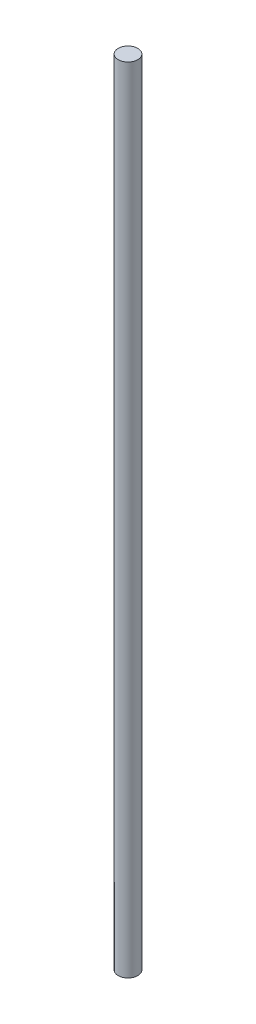
ISO-10303-21;
HEADER;
FILE_DESCRIPTION(('STEP AP214'),'2;1');
FILE_NAME('part.step','',(''),(''),'','','');
FILE_SCHEMA(('AUTOMOTIVE_DESIGN { 1 0 10303 214 1 1 1 1 }'));
ENDSEC;
DATA;
#1=APPLICATION_CONTEXT('core data for automotive mechanical design processes');
#2=APPLICATION_PROTOCOL_DEFINITION('international standard','automotive_design',2000,#1);
#3=PRODUCT_CONTEXT('',#1,'mechanical');
#4=PRODUCT('Part','Part','',(#3));
#5=PRODUCT_RELATED_PRODUCT_CATEGORY('part','',(#4));
#6=PRODUCT_DEFINITION_FORMATION('','',#4);
#7=PRODUCT_DEFINITION_CONTEXT('part definition',#1,'design');
#8=PRODUCT_DEFINITION('design','',#6,#7);
#9=PRODUCT_DEFINITION_SHAPE('','',#8);
#10=(LENGTH_UNIT() NAMED_UNIT(*) SI_UNIT(.MILLI.,.METRE.));
#11=(NAMED_UNIT(*) PLANE_ANGLE_UNIT() SI_UNIT($,.RADIAN.));
#12=(NAMED_UNIT(*) SI_UNIT($,.STERADIAN.) SOLID_ANGLE_UNIT());
#13=UNCERTAINTY_MEASURE_WITH_UNIT(LENGTH_MEASURE(1.E-05),#10,'distance_accuracy_value','');
#14=(GEOMETRIC_REPRESENTATION_CONTEXT(3) GLOBAL_UNCERTAINTY_ASSIGNED_CONTEXT((#13)) GLOBAL_UNIT_ASSIGNED_CONTEXT((#10,
#11,#12)) REPRESENTATION_CONTEXT('',''));
#15=CARTESIAN_POINT('',(0.,0.,0.));
#16=DIRECTION('',(0.,0.,1.));
#17=DIRECTION('',(1.,0.,0.));
#18=AXIS2_PLACEMENT_3D('',#15,#16,#17);
#19=CARTESIAN_POINT('',(0.,323.,0.));
#20=DIRECTION('',(0.,-1.,0.));
#21=DIRECTION('',(0.,0.,-1.));
#22=AXIS2_PLACEMENT_3D('',#19,#20,#21);
#23=CYLINDRICAL_SURFACE('',#22,4.);
#24=CARTESIAN_POINT('',(0.,323.,0.));
#25=DIRECTION('',(0.,1.,0.));
#26=DIRECTION('',(0.,0.,1.));
#27=AXIS2_PLACEMENT_3D('',#24,#25,#26);
#28=CIRCLE('',#27,4.);
#29=CARTESIAN_POINT('',(0.,323.,4.));
#30=VERTEX_POINT('',#29);
#31=EDGE_CURVE('E10',#30,#30,#28,.T.);
#32=ORIENTED_EDGE('',*,*,#31,.F.);
#33=EDGE_LOOP('',(#32));
#34=FACE_BOUND('',#33,.T.);
#35=CARTESIAN_POINT('',(0.,0.,0.));
#36=DIRECTION('',(0.,1.,0.));
#37=DIRECTION('',(0.,0.,1.));
#38=AXIS2_PLACEMENT_3D('',#35,#36,#37);
#39=CIRCLE('',#38,4.);
#40=CARTESIAN_POINT('',(0.,0.,4.));
#41=VERTEX_POINT('',#40);
#42=EDGE_CURVE('E34',#41,#41,#39,.T.);
#43=ORIENTED_EDGE('',*,*,#42,.T.);
#44=EDGE_LOOP('',(#43));
#45=FACE_BOUND('',#44,.T.);
#46=ADVANCED_FACE('F31',(#34,#45),#23,.T.);
#47=CARTESIAN_POINT('',(0.,323.,0.));
#48=DIRECTION('',(0.,1.,0.));
#49=DIRECTION('',(0.,0.,1.));
#50=AXIS2_PLACEMENT_3D('',#47,#48,#49);
#51=PLANE('',#50);
#52=ORIENTED_EDGE('',*,*,#31,.T.);
#53=EDGE_LOOP('',(#52));
#54=FACE_BOUND('',#53,.T.);
#55=ADVANCED_FACE('F46',(#54),#51,.T.);
#56=CARTESIAN_POINT('',(0.,0.,0.));
#57=DIRECTION('',(0.,1.,0.));
#58=DIRECTION('',(0.,0.,1.));
#59=AXIS2_PLACEMENT_3D('',#56,#57,#58);
#60=PLANE('',#59);
#61=ORIENTED_EDGE('',*,*,#42,.F.);
#62=EDGE_LOOP('',(#61));
#63=FACE_BOUND('',#62,.T.);
#64=ADVANCED_FACE('F44',(#63),#60,.F.);
#65=CLOSED_SHELL('',(#46,#55,#64));
#66=MANIFOLD_SOLID_BREP('B2',#65);
#67=ADVANCED_BREP_SHAPE_REPRESENTATION('',(#18,#66),#14);
#68=SHAPE_DEFINITION_REPRESENTATION(#9,#67);
ENDSEC;
END-ISO-10303-21;
